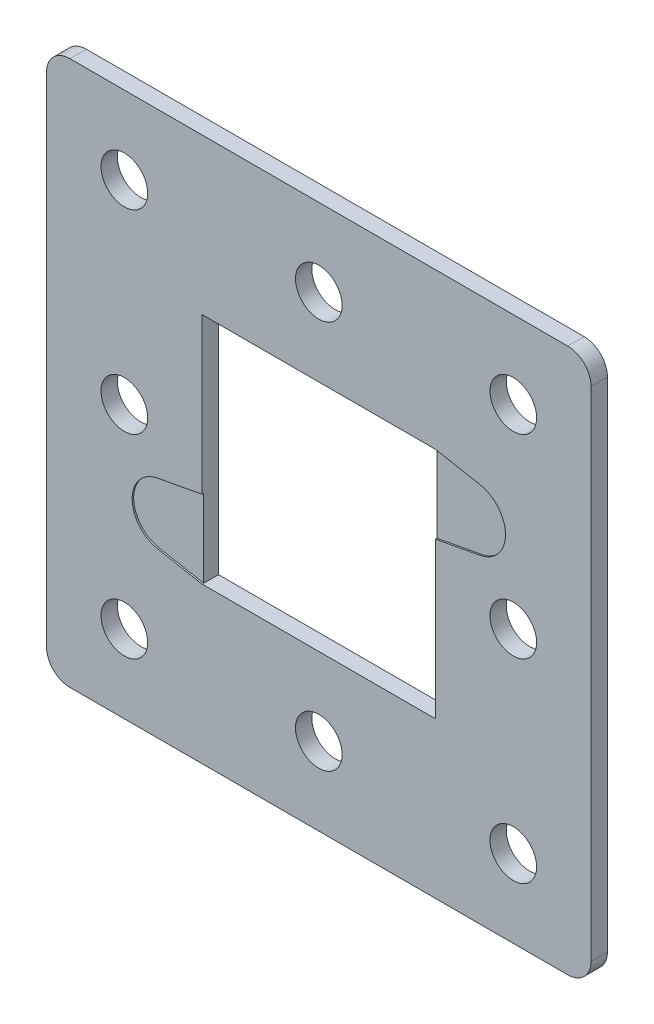
ISO-10303-21;
HEADER;
FILE_DESCRIPTION(('STEP AP214'),'2;1');
FILE_NAME('part.step','',(''),(''),'','','');
FILE_SCHEMA(('AUTOMOTIVE_DESIGN { 1 0 10303 214 1 1 1 1 }'));
ENDSEC;
DATA;
#1=APPLICATION_CONTEXT('core data for automotive mechanical design processes');
#2=APPLICATION_PROTOCOL_DEFINITION('international standard','automotive_design',2000,#1);
#3=PRODUCT_CONTEXT('',#1,'mechanical');
#4=PRODUCT('Part','Part','',(#3));
#5=PRODUCT_RELATED_PRODUCT_CATEGORY('part','',(#4));
#6=PRODUCT_DEFINITION_FORMATION('','',#4);
#7=PRODUCT_DEFINITION_CONTEXT('part definition',#1,'design');
#8=PRODUCT_DEFINITION('design','',#6,#7);
#9=PRODUCT_DEFINITION_SHAPE('','',#8);
#10=(LENGTH_UNIT() NAMED_UNIT(*) SI_UNIT(.MILLI.,.METRE.));
#11=(NAMED_UNIT(*) PLANE_ANGLE_UNIT() SI_UNIT($,.RADIAN.));
#12=(NAMED_UNIT(*) SI_UNIT($,.STERADIAN.) SOLID_ANGLE_UNIT());
#13=UNCERTAINTY_MEASURE_WITH_UNIT(LENGTH_MEASURE(1.E-05),#10,'distance_accuracy_value','');
#14=(GEOMETRIC_REPRESENTATION_CONTEXT(3) GLOBAL_UNCERTAINTY_ASSIGNED_CONTEXT((#13)) GLOBAL_UNIT_ASSIGNED_CONTEXT((#10,
#11,#12)) REPRESENTATION_CONTEXT('',''));
#15=CARTESIAN_POINT('',(0.,0.,0.));
#16=DIRECTION('',(0.,0.,1.));
#17=DIRECTION('',(1.,0.,0.));
#18=AXIS2_PLACEMENT_3D('',#15,#16,#17);
#19=CARTESIAN_POINT('',(35.,-35.,2.105));
#20=DIRECTION('',(-1.,0.,0.));
#21=DIRECTION('',(0.,0.,1.));
#22=AXIS2_PLACEMENT_3D('',#19,#20,#21);
#23=PLANE('',#22);
#24=DIRECTION('',(0.,1.,0.));
#25=VECTOR('',#24,1.);
#26=CARTESIAN_POINT('',(35.,-35.,0.));
#27=LINE('',#26,#25);
#28=CARTESIAN_POINT('',(35.,-32.,0.));
#29=VERTEX_POINT('',#28);
#30=CARTESIAN_POINT('',(35.,32.,0.));
#31=VERTEX_POINT('',#30);
#32=EDGE_CURVE('E305',#29,#31,#27,.T.);
#33=ORIENTED_EDGE('',*,*,#32,.T.);
#34=DIRECTION('',(0.,0.,-1.));
#35=VECTOR('',#34,1.);
#36=CARTESIAN_POINT('',(35.,32.,2.105));
#37=LINE('',#36,#35);
#38=CARTESIAN_POINT('',(35.,32.,2.105));
#39=VERTEX_POINT('',#38);
#40=EDGE_CURVE('E11',#31,#39,#37,.F.);
#41=ORIENTED_EDGE('',*,*,#40,.T.);
#42=DIRECTION('',(0.,1.,0.));
#43=VECTOR('',#42,1.);
#44=CARTESIAN_POINT('',(35.,-35.,2.105));
#45=LINE('',#44,#43);
#46=CARTESIAN_POINT('',(35.,-32.,2.105));
#47=VERTEX_POINT('',#46);
#48=EDGE_CURVE('E308',#47,#39,#45,.T.);
#49=ORIENTED_EDGE('',*,*,#48,.F.);
#50=DIRECTION('',(0.,0.,-1.));
#51=VECTOR('',#50,1.);
#52=CARTESIAN_POINT('',(35.,-32.,2.105));
#53=LINE('',#52,#51);
#54=EDGE_CURVE('E41',#47,#29,#53,.T.);
#55=ORIENTED_EDGE('',*,*,#54,.T.);
#56=EDGE_LOOP('',(#33,#41,#49,#55));
#57=FACE_BOUND('',#56,.T.);
#58=ADVANCED_FACE('F33',(#57),#23,.F.);
#59=CARTESIAN_POINT('',(-35.,35.,2.105));
#60=DIRECTION('',(0.,-1.,0.));
#61=DIRECTION('',(0.,0.,-1.));
#62=AXIS2_PLACEMENT_3D('',#59,#60,#61);
#63=PLANE('',#62);
#64=DIRECTION('',(-1.,0.,0.));
#65=VECTOR('',#64,1.);
#66=CARTESIAN_POINT('',(-35.,35.,0.));
#67=LINE('',#66,#65);
#68=CARTESIAN_POINT('',(32.,35.,0.));
#69=VERTEX_POINT('',#68);
#70=CARTESIAN_POINT('',(-32.,35.,0.));
#71=VERTEX_POINT('',#70);
#72=EDGE_CURVE('E322',#69,#71,#67,.T.);
#73=ORIENTED_EDGE('',*,*,#72,.T.);
#74=DIRECTION('',(0.,0.,-1.));
#75=VECTOR('',#74,1.);
#76=CARTESIAN_POINT('',(-32.,35.,2.105));
#77=LINE('',#76,#75);
#78=CARTESIAN_POINT('',(-32.,35.,2.105));
#79=VERTEX_POINT('',#78);
#80=EDGE_CURVE('E48',#71,#79,#77,.F.);
#81=ORIENTED_EDGE('',*,*,#80,.T.);
#82=DIRECTION('',(-1.,0.,0.));
#83=VECTOR('',#82,1.);
#84=CARTESIAN_POINT('',(-35.,35.,2.105));
#85=LINE('',#84,#83);
#86=CARTESIAN_POINT('',(32.,35.,2.105));
#87=VERTEX_POINT('',#86);
#88=EDGE_CURVE('E310',#87,#79,#85,.T.);
#89=ORIENTED_EDGE('',*,*,#88,.F.);
#90=DIRECTION('',(0.,0.,-1.));
#91=VECTOR('',#90,1.);
#92=CARTESIAN_POINT('',(32.,35.,2.105));
#93=LINE('',#92,#91);
#94=EDGE_CURVE('E353',#87,#69,#93,.T.);
#95=ORIENTED_EDGE('',*,*,#94,.T.);
#96=EDGE_LOOP('',(#73,#81,#89,#95));
#97=FACE_BOUND('',#96,.T.);
#98=ADVANCED_FACE('F371',(#97),#63,.F.);
#99=CARTESIAN_POINT('',(-35.,-35.,2.105));
#100=DIRECTION('',(1.,0.,0.));
#101=DIRECTION('',(0.,0.,-1.));
#102=AXIS2_PLACEMENT_3D('',#99,#100,#101);
#103=PLANE('',#102);
#104=DIRECTION('',(0.,-1.,0.));
#105=VECTOR('',#104,1.);
#106=CARTESIAN_POINT('',(-35.,-35.,0.));
#107=LINE('',#106,#105);
#108=CARTESIAN_POINT('',(-35.,32.,0.));
#109=VERTEX_POINT('',#108);
#110=CARTESIAN_POINT('',(-35.,-32.,0.));
#111=VERTEX_POINT('',#110);
#112=EDGE_CURVE('E324',#109,#111,#107,.T.);
#113=ORIENTED_EDGE('',*,*,#112,.T.);
#114=DIRECTION('',(0.,0.,-1.));
#115=VECTOR('',#114,1.);
#116=CARTESIAN_POINT('',(-35.,-32.,2.105));
#117=LINE('',#116,#115);
#118=CARTESIAN_POINT('',(-35.,-32.,2.105));
#119=VERTEX_POINT('',#118);
#120=EDGE_CURVE('E344',#111,#119,#117,.F.);
#121=ORIENTED_EDGE('',*,*,#120,.T.);
#122=DIRECTION('',(0.,-1.,0.));
#123=VECTOR('',#122,1.);
#124=CARTESIAN_POINT('',(-35.,-35.,2.105));
#125=LINE('',#124,#123);
#126=CARTESIAN_POINT('',(-35.,32.,2.105));
#127=VERTEX_POINT('',#126);
#128=EDGE_CURVE('E313',#127,#119,#125,.T.);
#129=ORIENTED_EDGE('',*,*,#128,.F.);
#130=DIRECTION('',(0.,0.,-1.));
#131=VECTOR('',#130,1.);
#132=CARTESIAN_POINT('',(-35.,32.,2.105));
#133=LINE('',#132,#131);
#134=EDGE_CURVE('E341',#127,#109,#133,.T.);
#135=ORIENTED_EDGE('',*,*,#134,.T.);
#136=EDGE_LOOP('',(#113,#121,#129,#135));
#137=FACE_BOUND('',#136,.T.);
#138=ADVANCED_FACE('F380',(#137),#103,.F.);
#139=CARTESIAN_POINT('',(-35.,-35.,2.105));
#140=DIRECTION('',(0.,1.,0.));
#141=DIRECTION('',(0.,0.,1.));
#142=AXIS2_PLACEMENT_3D('',#139,#140,#141);
#143=PLANE('',#142);
#144=DIRECTION('',(1.,0.,0.));
#145=VECTOR('',#144,1.);
#146=CARTESIAN_POINT('',(-35.,-35.,2.105));
#147=LINE('',#146,#145);
#148=CARTESIAN_POINT('',(-32.,-35.,2.105));
#149=VERTEX_POINT('',#148);
#150=CARTESIAN_POINT('',(32.,-35.,2.105));
#151=VERTEX_POINT('',#150);
#152=EDGE_CURVE('E316',#149,#151,#147,.T.);
#153=ORIENTED_EDGE('',*,*,#152,.F.);
#154=DIRECTION('',(0.,0.,-1.));
#155=VECTOR('',#154,1.);
#156=CARTESIAN_POINT('',(-32.,-35.,2.105));
#157=LINE('',#156,#155);
#158=CARTESIAN_POINT('',(-32.,-35.,0.));
#159=VERTEX_POINT('',#158);
#160=EDGE_CURVE('E330',#149,#159,#157,.T.);
#161=ORIENTED_EDGE('',*,*,#160,.T.);
#162=DIRECTION('',(1.,0.,0.));
#163=VECTOR('',#162,1.);
#164=CARTESIAN_POINT('',(-35.,-35.,0.));
#165=LINE('',#164,#163);
#166=CARTESIAN_POINT('',(32.,-35.,0.));
#167=VERTEX_POINT('',#166);
#168=EDGE_CURVE('E311',#159,#167,#165,.T.);
#169=ORIENTED_EDGE('',*,*,#168,.T.);
#170=DIRECTION('',(0.,0.,-1.));
#171=VECTOR('',#170,1.);
#172=CARTESIAN_POINT('',(32.,-35.,2.105));
#173=LINE('',#172,#171);
#174=EDGE_CURVE('E319',#167,#151,#173,.F.);
#175=ORIENTED_EDGE('',*,*,#174,.T.);
#176=EDGE_LOOP('',(#153,#161,#169,#175));
#177=FACE_BOUND('',#176,.T.);
#178=ADVANCED_FACE('F388',(#177),#143,.F.);
#179=CARTESIAN_POINT('',(0.,0.,2.105));
#180=DIRECTION('',(0.,0.,-1.));
#181=DIRECTION('',(-1.,0.,0.));
#182=AXIS2_PLACEMENT_3D('',#179,#180,#181);
#183=PLANE('',#182);
#184=CARTESIAN_POINT('',(25.,25.,2.105));
#185=DIRECTION('',(0.,0.,1.));
#186=DIRECTION('',(1.,0.,0.));
#187=AXIS2_PLACEMENT_3D('',#184,#185,#186);
#188=CIRCLE('',#187,3.);
#189=CARTESIAN_POINT('',(28.,25.,2.105));
#190=VERTEX_POINT('',#189);
#191=EDGE_CURVE('E282',#190,#190,#188,.T.);
#192=ORIENTED_EDGE('',*,*,#191,.F.);
#193=EDGE_LOOP('',(#192));
#194=FACE_BOUND('',#193,.T.);
#195=CARTESIAN_POINT('',(25.,0.,2.105));
#196=DIRECTION('',(0.,0.,1.));
#197=DIRECTION('',(1.,0.,0.));
#198=AXIS2_PLACEMENT_3D('',#195,#196,#197);
#199=CIRCLE('',#198,3.);
#200=CARTESIAN_POINT('',(28.,0.,2.105));
#201=VERTEX_POINT('',#200);
#202=EDGE_CURVE('E288',#201,#201,#199,.T.);
#203=ORIENTED_EDGE('',*,*,#202,.F.);
#204=EDGE_LOOP('',(#203));
#205=FACE_BOUND('',#204,.T.);
#206=CARTESIAN_POINT('',(25.,-25.,2.105));
#207=DIRECTION('',(0.,0.,1.));
#208=DIRECTION('',(1.,0.,0.));
#209=AXIS2_PLACEMENT_3D('',#206,#207,#208);
#210=CIRCLE('',#209,3.);
#211=CARTESIAN_POINT('',(28.,-25.,2.105));
#212=VERTEX_POINT('',#211);
#213=EDGE_CURVE('E294',#212,#212,#210,.T.);
#214=ORIENTED_EDGE('',*,*,#213,.F.);
#215=EDGE_LOOP('',(#214));
#216=FACE_BOUND('',#215,.T.);
#217=CARTESIAN_POINT('',(0.,-25.,2.105));
#218=DIRECTION('',(0.,0.,1.));
#219=DIRECTION('',(1.,0.,0.));
#220=AXIS2_PLACEMENT_3D('',#217,#218,#219);
#221=CIRCLE('',#220,3.);
#222=CARTESIAN_POINT('',(3.,-25.,2.105));
#223=VERTEX_POINT('',#222);
#224=EDGE_CURVE('E269',#223,#223,#221,.T.);
#225=ORIENTED_EDGE('',*,*,#224,.F.);
#226=EDGE_LOOP('',(#225));
#227=FACE_BOUND('',#226,.T.);
#228=DIRECTION('',(1.,0.,0.));
#229=VECTOR('',#228,1.);
#230=CARTESIAN_POINT('',(-15.,-15.,2.105));
#231=LINE('',#230,#229);
#232=CARTESIAN_POINT('',(-15.,-15.,2.105));
#233=VERTEX_POINT('',#232);
#234=CARTESIAN_POINT('',(15.,-15.,2.105));
#235=VERTEX_POINT('',#234);
#236=EDGE_CURVE('E239',#233,#235,#231,.T.);
#237=ORIENTED_EDGE('',*,*,#236,.F.);
#238=DIRECTION('',(0.98309518948453,-0.18309518948453,0.));
#239=VECTOR('',#238,1.);
#240=CARTESIAN_POINT('',(-15.,-15.,2.105));
#241=LINE('',#240,#239);
#242=CARTESIAN_POINT('',(-20.7323807579381,-13.9323807579381,2.105));
#243=VERTEX_POINT('',#242);
#244=EDGE_CURVE('E185',#243,#233,#241,.T.);
#245=ORIENTED_EDGE('',*,*,#244,.F.);
#246=CARTESIAN_POINT('',(-20.,-10.,2.105));
#247=DIRECTION('',(0.,0.,1.));
#248=DIRECTION('',(1.,0.,0.));
#249=AXIS2_PLACEMENT_3D('',#246,#247,#248);
#250=CIRCLE('',#249,4.);
#251=CARTESIAN_POINT('',(-20.7323807579381,-6.06761924206188,2.105));
#252=VERTEX_POINT('',#251);
#253=EDGE_CURVE('E695',#252,#243,#250,.T.);
#254=ORIENTED_EDGE('',*,*,#253,.F.);
#255=DIRECTION('',(-0.98309518948453,-0.18309518948453,0.));
#256=VECTOR('',#255,1.);
#257=CARTESIAN_POINT('',(-15.,-5.,2.105));
#258=LINE('',#257,#256);
#259=CARTESIAN_POINT('',(-15.,-5.,2.105));
#260=VERTEX_POINT('',#259);
#261=EDGE_CURVE('E220',#260,#252,#258,.T.);
#262=ORIENTED_EDGE('',*,*,#261,.F.);
#263=DIRECTION('',(0.,-1.,0.));
#264=VECTOR('',#263,1.);
#265=CARTESIAN_POINT('',(-15.,-15.,2.105));
#266=LINE('',#265,#264);
#267=CARTESIAN_POINT('',(-15.,15.,2.105));
#268=VERTEX_POINT('',#267);
#269=EDGE_CURVE('E190',#268,#260,#266,.T.);
#270=ORIENTED_EDGE('',*,*,#269,.F.);
#271=DIRECTION('',(-1.,0.,0.));
#272=VECTOR('',#271,1.);
#273=CARTESIAN_POINT('',(-15.,15.,2.105));
#274=LINE('',#273,#272);
#275=CARTESIAN_POINT('',(15.,15.,2.105));
#276=VERTEX_POINT('',#275);
#277=EDGE_CURVE('E252',#276,#268,#274,.T.);
#278=ORIENTED_EDGE('',*,*,#277,.F.);
#279=DIRECTION('',(-0.98309518948453,0.18309518948453,0.));
#280=VECTOR('',#279,1.);
#281=CARTESIAN_POINT('',(15.,15.,2.105));
#282=LINE('',#281,#280);
#283=CARTESIAN_POINT('',(20.7323807579381,13.9323807579381,2.105));
#284=VERTEX_POINT('',#283);
#285=EDGE_CURVE('E211',#284,#276,#282,.T.);
#286=ORIENTED_EDGE('',*,*,#285,.F.);
#287=CARTESIAN_POINT('',(20.,10.,2.105));
#288=DIRECTION('',(0.,0.,1.));
#289=DIRECTION('',(1.,0.,0.));
#290=AXIS2_PLACEMENT_3D('',#287,#288,#289);
#291=CIRCLE('',#290,4.);
#292=CARTESIAN_POINT('',(20.7323807579381,6.06761924206188,2.105));
#293=VERTEX_POINT('',#292);
#294=EDGE_CURVE('E201',#293,#284,#291,.T.);
#295=ORIENTED_EDGE('',*,*,#294,.F.);
#296=DIRECTION('',(0.98309518948453,0.18309518948453,0.));
#297=VECTOR('',#296,1.);
#298=CARTESIAN_POINT('',(15.,5.,2.105));
#299=LINE('',#298,#297);
#300=CARTESIAN_POINT('',(15.,5.,2.105));
#301=VERTEX_POINT('',#300);
#302=EDGE_CURVE('E213',#301,#293,#299,.T.);
#303=ORIENTED_EDGE('',*,*,#302,.F.);
#304=DIRECTION('',(0.,1.,0.));
#305=VECTOR('',#304,1.);
#306=CARTESIAN_POINT('',(15.,-15.,2.105));
#307=LINE('',#306,#305);
#308=EDGE_CURVE('E249',#235,#301,#307,.T.);
#309=ORIENTED_EDGE('',*,*,#308,.F.);
#310=EDGE_LOOP('',(#237,#245,#254,#262,#270,#278,#286,#295,#303,#309));
#311=FACE_BOUND('',#310,.T.);
#312=CARTESIAN_POINT('',(-25.,25.,2.105));
#313=DIRECTION('',(0.,0.,1.));
#314=DIRECTION('',(1.,0.,0.));
#315=AXIS2_PLACEMENT_3D('',#312,#313,#314);
#316=CIRCLE('',#315,3.);
#317=CARTESIAN_POINT('',(-22.,25.,2.105));
#318=VERTEX_POINT('',#317);
#319=EDGE_CURVE('E231',#318,#318,#316,.T.);
#320=ORIENTED_EDGE('',*,*,#319,.F.);
#321=EDGE_LOOP('',(#320));
#322=FACE_BOUND('',#321,.T.);
#323=CARTESIAN_POINT('',(-25.,0.,2.105));
#324=DIRECTION('',(0.,0.,1.));
#325=DIRECTION('',(1.,0.,0.));
#326=AXIS2_PLACEMENT_3D('',#323,#324,#325);
#327=CIRCLE('',#326,3.);
#328=CARTESIAN_POINT('',(-22.,0.,2.105));
#329=VERTEX_POINT('',#328);
#330=EDGE_CURVE('E230',#329,#329,#327,.T.);
#331=ORIENTED_EDGE('',*,*,#330,.F.);
#332=EDGE_LOOP('',(#331));
#333=FACE_BOUND('',#332,.T.);
#334=CARTESIAN_POINT('',(-25.,-25.,2.105));
#335=DIRECTION('',(0.,0.,1.));
#336=DIRECTION('',(1.,0.,0.));
#337=AXIS2_PLACEMENT_3D('',#334,#335,#336);
#338=CIRCLE('',#337,3.);
#339=CARTESIAN_POINT('',(-22.,-25.,2.105));
#340=VERTEX_POINT('',#339);
#341=EDGE_CURVE('E270',#340,#340,#338,.T.);
#342=ORIENTED_EDGE('',*,*,#341,.F.);
#343=EDGE_LOOP('',(#342));
#344=FACE_BOUND('',#343,.T.);
#345=CARTESIAN_POINT('',(0.,25.,2.105));
#346=DIRECTION('',(0.,0.,1.));
#347=DIRECTION('',(1.,0.,0.));
#348=AXIS2_PLACEMENT_3D('',#345,#346,#347);
#349=CIRCLE('',#348,3.);
#350=CARTESIAN_POINT('',(3.,25.,2.105));
#351=VERTEX_POINT('',#350);
#352=EDGE_CURVE('E281',#351,#351,#349,.T.);
#353=ORIENTED_EDGE('',*,*,#352,.F.);
#354=EDGE_LOOP('',(#353));
#355=FACE_BOUND('',#354,.T.);
#356=ORIENTED_EDGE('',*,*,#128,.T.);
#357=CARTESIAN_POINT('',(-32.,-32.,2.105));
#358=DIRECTION('',(0.,0.,-1.));
#359=DIRECTION('',(-1.,0.,0.));
#360=AXIS2_PLACEMENT_3D('',#357,#358,#359);
#361=CIRCLE('',#360,3.);
#362=EDGE_CURVE('E351',#119,#149,#361,.F.);
#363=ORIENTED_EDGE('',*,*,#362,.T.);
#364=ORIENTED_EDGE('',*,*,#152,.T.);
#365=CARTESIAN_POINT('',(32.,-32.,2.105));
#366=DIRECTION('',(0.,0.,-1.));
#367=DIRECTION('',(-1.,0.,0.));
#368=AXIS2_PLACEMENT_3D('',#365,#366,#367);
#369=CIRCLE('',#368,3.);
#370=EDGE_CURVE('E346',#151,#47,#369,.F.);
#371=ORIENTED_EDGE('',*,*,#370,.T.);
#372=ORIENTED_EDGE('',*,*,#48,.T.);
#373=CARTESIAN_POINT('',(32.,32.,2.105));
#374=DIRECTION('',(0.,0.,-1.));
#375=DIRECTION('',(-1.,0.,0.));
#376=AXIS2_PLACEMENT_3D('',#373,#374,#375);
#377=CIRCLE('',#376,3.);
#378=EDGE_CURVE('E55',#39,#87,#377,.F.);
#379=ORIENTED_EDGE('',*,*,#378,.T.);
#380=ORIENTED_EDGE('',*,*,#88,.T.);
#381=CARTESIAN_POINT('',(-32.,32.,2.105));
#382=DIRECTION('',(0.,0.,-1.));
#383=DIRECTION('',(-1.,0.,0.));
#384=AXIS2_PLACEMENT_3D('',#381,#382,#383);
#385=CIRCLE('',#384,3.);
#386=EDGE_CURVE('E349',#79,#127,#385,.F.);
#387=ORIENTED_EDGE('',*,*,#386,.T.);
#388=EDGE_LOOP('',(#356,#363,#364,#371,#372,#379,#380,#387));
#389=FACE_BOUND('',#388,.T.);
#390=ADVANCED_FACE('F373',(#194,#205,#216,#227,#311,#322,#333,#344,#355,#389),#183,.F.);
#391=CARTESIAN_POINT('',(0.,0.,0.));
#392=DIRECTION('',(0.,0.,-1.));
#393=DIRECTION('',(-1.,0.,0.));
#394=AXIS2_PLACEMENT_3D('',#391,#392,#393);
#395=PLANE('',#394);
#396=CARTESIAN_POINT('',(25.,25.,0.));
#397=DIRECTION('',(0.,0.,1.));
#398=DIRECTION('',(1.,0.,0.));
#399=AXIS2_PLACEMENT_3D('',#396,#397,#398);
#400=CIRCLE('',#399,3.);
#401=CARTESIAN_POINT('',(28.,25.,0.));
#402=VERTEX_POINT('',#401);
#403=EDGE_CURVE('E278',#402,#402,#400,.T.);
#404=ORIENTED_EDGE('',*,*,#403,.T.);
#405=EDGE_LOOP('',(#404));
#406=FACE_BOUND('',#405,.T.);
#407=CARTESIAN_POINT('',(25.,0.,0.));
#408=DIRECTION('',(0.,0.,1.));
#409=DIRECTION('',(1.,0.,0.));
#410=AXIS2_PLACEMENT_3D('',#407,#408,#409);
#411=CIRCLE('',#410,3.);
#412=CARTESIAN_POINT('',(28.,0.,0.));
#413=VERTEX_POINT('',#412);
#414=EDGE_CURVE('E285',#413,#413,#411,.T.);
#415=ORIENTED_EDGE('',*,*,#414,.T.);
#416=EDGE_LOOP('',(#415));
#417=FACE_BOUND('',#416,.T.);
#418=CARTESIAN_POINT('',(25.,-25.,0.));
#419=DIRECTION('',(0.,0.,1.));
#420=DIRECTION('',(1.,0.,0.));
#421=AXIS2_PLACEMENT_3D('',#418,#419,#420);
#422=CIRCLE('',#421,3.);
#423=CARTESIAN_POINT('',(28.,-25.,0.));
#424=VERTEX_POINT('',#423);
#425=EDGE_CURVE('E291',#424,#424,#422,.T.);
#426=ORIENTED_EDGE('',*,*,#425,.T.);
#427=EDGE_LOOP('',(#426));
#428=FACE_BOUND('',#427,.T.);
#429=CARTESIAN_POINT('',(0.,-25.,0.));
#430=DIRECTION('',(0.,0.,1.));
#431=DIRECTION('',(1.,0.,0.));
#432=AXIS2_PLACEMENT_3D('',#429,#430,#431);
#433=CIRCLE('',#432,3.);
#434=CARTESIAN_POINT('',(3.,-25.,0.));
#435=VERTEX_POINT('',#434);
#436=EDGE_CURVE('E297',#435,#435,#433,.T.);
#437=ORIENTED_EDGE('',*,*,#436,.T.);
#438=EDGE_LOOP('',(#437));
#439=FACE_BOUND('',#438,.T.);
#440=DIRECTION('',(0.,1.,0.));
#441=VECTOR('',#440,1.);
#442=CARTESIAN_POINT('',(15.,-15.,0.));
#443=LINE('',#442,#441);
#444=CARTESIAN_POINT('',(15.,-15.,0.));
#445=VERTEX_POINT('',#444);
#446=CARTESIAN_POINT('',(15.,15.,0.));
#447=VERTEX_POINT('',#446);
#448=EDGE_CURVE('E235',#445,#447,#443,.T.);
#449=ORIENTED_EDGE('',*,*,#448,.T.);
#450=DIRECTION('',(-1.,0.,0.));
#451=VECTOR('',#450,1.);
#452=CARTESIAN_POINT('',(-15.,15.,0.));
#453=LINE('',#452,#451);
#454=CARTESIAN_POINT('',(-15.,15.,0.));
#455=VERTEX_POINT('',#454);
#456=EDGE_CURVE('E238',#447,#455,#453,.T.);
#457=ORIENTED_EDGE('',*,*,#456,.T.);
#458=DIRECTION('',(0.,-1.,0.));
#459=VECTOR('',#458,1.);
#460=CARTESIAN_POINT('',(-15.,-15.,0.));
#461=LINE('',#460,#459);
#462=CARTESIAN_POINT('',(-15.,-15.,0.));
#463=VERTEX_POINT('',#462);
#464=EDGE_CURVE('E242',#455,#463,#461,.T.);
#465=ORIENTED_EDGE('',*,*,#464,.T.);
#466=DIRECTION('',(1.,0.,0.));
#467=VECTOR('',#466,1.);
#468=CARTESIAN_POINT('',(-15.,-15.,0.));
#469=LINE('',#468,#467);
#470=EDGE_CURVE('E245',#463,#445,#469,.T.);
#471=ORIENTED_EDGE('',*,*,#470,.T.);
#472=EDGE_LOOP('',(#449,#457,#465,#471));
#473=FACE_BOUND('',#472,.T.);
#474=CARTESIAN_POINT('',(-25.,25.,0.));
#475=DIRECTION('',(0.,0.,1.));
#476=DIRECTION('',(1.,0.,0.));
#477=AXIS2_PLACEMENT_3D('',#474,#475,#476);
#478=CIRCLE('',#477,3.);
#479=CARTESIAN_POINT('',(-22.,25.,0.));
#480=VERTEX_POINT('',#479);
#481=EDGE_CURVE('E227',#480,#480,#478,.T.);
#482=ORIENTED_EDGE('',*,*,#481,.T.);
#483=EDGE_LOOP('',(#482));
#484=FACE_BOUND('',#483,.T.);
#485=CARTESIAN_POINT('',(-25.,0.,0.));
#486=DIRECTION('',(0.,0.,1.));
#487=DIRECTION('',(1.,0.,0.));
#488=AXIS2_PLACEMENT_3D('',#485,#486,#487);
#489=CIRCLE('',#488,3.);
#490=CARTESIAN_POINT('',(-22.,0.,0.));
#491=VERTEX_POINT('',#490);
#492=EDGE_CURVE('E273',#491,#491,#489,.T.);
#493=ORIENTED_EDGE('',*,*,#492,.T.);
#494=EDGE_LOOP('',(#493));
#495=FACE_BOUND('',#494,.T.);
#496=CARTESIAN_POINT('',(-25.,-25.,0.));
#497=DIRECTION('',(0.,0.,1.));
#498=DIRECTION('',(1.,0.,0.));
#499=AXIS2_PLACEMENT_3D('',#496,#497,#498);
#500=CIRCLE('',#499,3.);
#501=CARTESIAN_POINT('',(-22.,-25.,0.));
#502=VERTEX_POINT('',#501);
#503=EDGE_CURVE('E266',#502,#502,#500,.T.);
#504=ORIENTED_EDGE('',*,*,#503,.T.);
#505=EDGE_LOOP('',(#504));
#506=FACE_BOUND('',#505,.T.);
#507=CARTESIAN_POINT('',(0.,25.,0.));
#508=DIRECTION('',(0.,0.,1.));
#509=DIRECTION('',(1.,0.,0.));
#510=AXIS2_PLACEMENT_3D('',#507,#508,#509);
#511=CIRCLE('',#510,3.);
#512=CARTESIAN_POINT('',(3.,25.,0.));
#513=VERTEX_POINT('',#512);
#514=EDGE_CURVE('E302',#513,#513,#511,.T.);
#515=ORIENTED_EDGE('',*,*,#514,.T.);
#516=EDGE_LOOP('',(#515));
#517=FACE_BOUND('',#516,.T.);
#518=ORIENTED_EDGE('',*,*,#168,.F.);
#519=CARTESIAN_POINT('',(-32.,-32.,0.));
#520=DIRECTION('',(0.,0.,-1.));
#521=DIRECTION('',(-1.,0.,0.));
#522=AXIS2_PLACEMENT_3D('',#519,#520,#521);
#523=CIRCLE('',#522,3.);
#524=EDGE_CURVE('E339',#159,#111,#523,.T.);
#525=ORIENTED_EDGE('',*,*,#524,.T.);
#526=ORIENTED_EDGE('',*,*,#112,.F.);
#527=CARTESIAN_POINT('',(-32.,32.,0.));
#528=DIRECTION('',(0.,0.,-1.));
#529=DIRECTION('',(-1.,0.,0.));
#530=AXIS2_PLACEMENT_3D('',#527,#528,#529);
#531=CIRCLE('',#530,3.);
#532=EDGE_CURVE('E337',#109,#71,#531,.T.);
#533=ORIENTED_EDGE('',*,*,#532,.T.);
#534=ORIENTED_EDGE('',*,*,#72,.F.);
#535=CARTESIAN_POINT('',(32.,32.,0.));
#536=DIRECTION('',(0.,0.,-1.));
#537=DIRECTION('',(-1.,0.,0.));
#538=AXIS2_PLACEMENT_3D('',#535,#536,#537);
#539=CIRCLE('',#538,3.);
#540=EDGE_CURVE('E335',#69,#31,#539,.T.);
#541=ORIENTED_EDGE('',*,*,#540,.T.);
#542=ORIENTED_EDGE('',*,*,#32,.F.);
#543=CARTESIAN_POINT('',(32.,-32.,0.));
#544=DIRECTION('',(0.,0.,-1.));
#545=DIRECTION('',(-1.,0.,0.));
#546=AXIS2_PLACEMENT_3D('',#543,#544,#545);
#547=CIRCLE('',#546,3.);
#548=EDGE_CURVE('E333',#29,#167,#547,.T.);
#549=ORIENTED_EDGE('',*,*,#548,.T.);
#550=EDGE_LOOP('',(#518,#525,#526,#533,#534,#541,#542,#549));
#551=FACE_BOUND('',#550,.T.);
#552=ADVANCED_FACE('F366',(#406,#417,#428,#439,#473,#484,#495,#506,#517,#551),#395,.T.);
#553=CARTESIAN_POINT('',(0.,25.,0.));
#554=DIRECTION('',(0.,0.,1.));
#555=DIRECTION('',(1.,0.,0.));
#556=AXIS2_PLACEMENT_3D('',#553,#554,#555);
#557=CYLINDRICAL_SURFACE('',#556,3.);
#558=ORIENTED_EDGE('',*,*,#514,.F.);
#559=EDGE_LOOP('',(#558));
#560=FACE_BOUND('',#559,.T.);
#561=ORIENTED_EDGE('',*,*,#352,.T.);
#562=EDGE_LOOP('',(#561));
#563=FACE_BOUND('',#562,.T.);
#564=ADVANCED_FACE('F591',(#560,#563),#557,.F.);
#565=CARTESIAN_POINT('',(-25.,-25.,0.));
#566=DIRECTION('',(0.,0.,1.));
#567=DIRECTION('',(1.,0.,0.));
#568=AXIS2_PLACEMENT_3D('',#565,#566,#567);
#569=CYLINDRICAL_SURFACE('',#568,3.);
#570=ORIENTED_EDGE('',*,*,#503,.F.);
#571=EDGE_LOOP('',(#570));
#572=FACE_BOUND('',#571,.T.);
#573=ORIENTED_EDGE('',*,*,#341,.T.);
#574=EDGE_LOOP('',(#573));
#575=FACE_BOUND('',#574,.T.);
#576=ADVANCED_FACE('F582',(#572,#575),#569,.F.);
#577=CARTESIAN_POINT('',(-25.,0.,0.));
#578=DIRECTION('',(0.,0.,1.));
#579=DIRECTION('',(1.,0.,0.));
#580=AXIS2_PLACEMENT_3D('',#577,#578,#579);
#581=CYLINDRICAL_SURFACE('',#580,3.);
#582=ORIENTED_EDGE('',*,*,#492,.F.);
#583=EDGE_LOOP('',(#582));
#584=FACE_BOUND('',#583,.T.);
#585=ORIENTED_EDGE('',*,*,#330,.T.);
#586=EDGE_LOOP('',(#585));
#587=FACE_BOUND('',#586,.T.);
#588=ADVANCED_FACE('F573',(#584,#587),#581,.F.);
#589=CARTESIAN_POINT('',(-25.,25.,0.));
#590=DIRECTION('',(0.,0.,1.));
#591=DIRECTION('',(1.,0.,0.));
#592=AXIS2_PLACEMENT_3D('',#589,#590,#591);
#593=CYLINDRICAL_SURFACE('',#592,3.);
#594=ORIENTED_EDGE('',*,*,#481,.F.);
#595=EDGE_LOOP('',(#594));
#596=FACE_BOUND('',#595,.T.);
#597=ORIENTED_EDGE('',*,*,#319,.T.);
#598=EDGE_LOOP('',(#597));
#599=FACE_BOUND('',#598,.T.);
#600=ADVANCED_FACE('F565',(#596,#599),#593,.F.);
#601=CARTESIAN_POINT('',(15.,-15.,0.));
#602=DIRECTION('',(1.,0.,0.));
#603=DIRECTION('',(0.,0.,-1.));
#604=AXIS2_PLACEMENT_3D('',#601,#602,#603);
#605=PLANE('',#604);
#606=ORIENTED_EDGE('',*,*,#308,.T.);
#607=DIRECTION('',(0.,0.,1.));
#608=VECTOR('',#607,1.);
#609=CARTESIAN_POINT('',(15.,5.,1.905));
#610=LINE('',#609,#608);
#611=CARTESIAN_POINT('',(15.,5.,1.905));
#612=VERTEX_POINT('',#611);
#613=EDGE_CURVE('E223',#612,#301,#610,.T.);
#614=ORIENTED_EDGE('',*,*,#613,.F.);
#615=DIRECTION('',(0.,-1.,0.));
#616=VECTOR('',#615,1.);
#617=CARTESIAN_POINT('',(15.,5.,1.905));
#618=LINE('',#617,#616);
#619=CARTESIAN_POINT('',(15.,15.,1.905));
#620=VERTEX_POINT('',#619);
#621=EDGE_CURVE('E200',#620,#612,#618,.T.);
#622=ORIENTED_EDGE('',*,*,#621,.F.);
#623=DIRECTION('',(0.,0.,1.));
#624=VECTOR('',#623,1.);
#625=CARTESIAN_POINT('',(15.,15.,0.));
#626=LINE('',#625,#624);
#627=EDGE_CURVE('E248',#447,#620,#626,.T.);
#628=ORIENTED_EDGE('',*,*,#627,.F.);
#629=ORIENTED_EDGE('',*,*,#448,.F.);
#630=DIRECTION('',(0.,0.,1.));
#631=VECTOR('',#630,1.);
#632=CARTESIAN_POINT('',(15.,-15.,0.));
#633=LINE('',#632,#631);
#634=EDGE_CURVE('E234',#445,#235,#633,.T.);
#635=ORIENTED_EDGE('',*,*,#634,.T.);
#636=EDGE_LOOP('',(#606,#614,#622,#628,#629,#635));
#637=FACE_BOUND('',#636,.T.);
#638=ADVANCED_FACE('F557',(#637),#605,.F.);
#639=CARTESIAN_POINT('',(-15.,-15.,0.));
#640=DIRECTION('',(0.,-1.,0.));
#641=DIRECTION('',(0.,0.,-1.));
#642=AXIS2_PLACEMENT_3D('',#639,#640,#641);
#643=PLANE('',#642);
#644=ORIENTED_EDGE('',*,*,#236,.T.);
#645=ORIENTED_EDGE('',*,*,#634,.F.);
#646=ORIENTED_EDGE('',*,*,#470,.F.);
#647=DIRECTION('',(0.,0.,1.));
#648=VECTOR('',#647,1.);
#649=CARTESIAN_POINT('',(-15.,-15.,0.));
#650=LINE('',#649,#648);
#651=CARTESIAN_POINT('',(-15.,-15.,1.905));
#652=VERTEX_POINT('',#651);
#653=EDGE_CURVE('E260',#463,#652,#650,.T.);
#654=ORIENTED_EDGE('',*,*,#653,.T.);
#655=DIRECTION('',(0.,0.,1.));
#656=VECTOR('',#655,1.);
#657=CARTESIAN_POINT('',(-15.,-15.,1.905));
#658=LINE('',#657,#656);
#659=EDGE_CURVE('E253',#652,#233,#658,.T.);
#660=ORIENTED_EDGE('',*,*,#659,.T.);
#661=EDGE_LOOP('',(#644,#645,#646,#654,#660));
#662=FACE_BOUND('',#661,.T.);
#663=ADVANCED_FACE('F549',(#662),#643,.F.);
#664=CARTESIAN_POINT('',(-15.,-15.,0.));
#665=DIRECTION('',(-1.,0.,0.));
#666=DIRECTION('',(0.,0.,1.));
#667=AXIS2_PLACEMENT_3D('',#664,#665,#666);
#668=PLANE('',#667);
#669=ORIENTED_EDGE('',*,*,#269,.T.);
#670=DIRECTION('',(0.,0.,1.));
#671=VECTOR('',#670,1.);
#672=CARTESIAN_POINT('',(-15.,-5.,1.905));
#673=LINE('',#672,#671);
#674=CARTESIAN_POINT('',(-15.,-5.,1.905));
#675=VERTEX_POINT('',#674);
#676=EDGE_CURVE('E169',#675,#260,#673,.T.);
#677=ORIENTED_EDGE('',*,*,#676,.F.);
#678=DIRECTION('',(0.,1.,0.));
#679=VECTOR('',#678,1.);
#680=CARTESIAN_POINT('',(-15.,-15.,1.905));
#681=LINE('',#680,#679);
#682=EDGE_CURVE('E176',#652,#675,#681,.T.);
#683=ORIENTED_EDGE('',*,*,#682,.F.);
#684=ORIENTED_EDGE('',*,*,#653,.F.);
#685=ORIENTED_EDGE('',*,*,#464,.F.);
#686=DIRECTION('',(0.,0.,1.));
#687=VECTOR('',#686,1.);
#688=CARTESIAN_POINT('',(-15.,15.,0.));
#689=LINE('',#688,#687);
#690=EDGE_CURVE('E262',#455,#268,#689,.T.);
#691=ORIENTED_EDGE('',*,*,#690,.T.);
#692=EDGE_LOOP('',(#669,#677,#683,#684,#685,#691));
#693=FACE_BOUND('',#692,.T.);
#694=ADVANCED_FACE('F188',(#693),#668,.F.);
#695=CARTESIAN_POINT('',(-15.,15.,0.));
#696=DIRECTION('',(0.,1.,0.));
#697=DIRECTION('',(0.,0.,1.));
#698=AXIS2_PLACEMENT_3D('',#695,#696,#697);
#699=PLANE('',#698);
#700=ORIENTED_EDGE('',*,*,#277,.T.);
#701=ORIENTED_EDGE('',*,*,#690,.F.);
#702=ORIENTED_EDGE('',*,*,#456,.F.);
#703=ORIENTED_EDGE('',*,*,#627,.T.);
#704=DIRECTION('',(0.,0.,1.));
#705=VECTOR('',#704,1.);
#706=CARTESIAN_POINT('',(15.,15.,1.905));
#707=LINE('',#706,#705);
#708=EDGE_CURVE('E210',#620,#276,#707,.T.);
#709=ORIENTED_EDGE('',*,*,#708,.T.);
#710=EDGE_LOOP('',(#700,#701,#702,#703,#709));
#711=FACE_BOUND('',#710,.T.);
#712=ADVANCED_FACE('F532',(#711),#699,.F.);
#713=CARTESIAN_POINT('',(0.,-25.,0.));
#714=DIRECTION('',(0.,0.,1.));
#715=DIRECTION('',(1.,0.,0.));
#716=AXIS2_PLACEMENT_3D('',#713,#714,#715);
#717=CYLINDRICAL_SURFACE('',#716,3.);
#718=ORIENTED_EDGE('',*,*,#436,.F.);
#719=EDGE_LOOP('',(#718));
#720=FACE_BOUND('',#719,.T.);
#721=ORIENTED_EDGE('',*,*,#224,.T.);
#722=EDGE_LOOP('',(#721));
#723=FACE_BOUND('',#722,.T.);
#724=ADVANCED_FACE('F523',(#720,#723),#717,.F.);
#725=CARTESIAN_POINT('',(25.,-25.,0.));
#726=DIRECTION('',(0.,0.,1.));
#727=DIRECTION('',(1.,0.,0.));
#728=AXIS2_PLACEMENT_3D('',#725,#726,#727);
#729=CYLINDRICAL_SURFACE('',#728,3.);
#730=ORIENTED_EDGE('',*,*,#425,.F.);
#731=EDGE_LOOP('',(#730));
#732=FACE_BOUND('',#731,.T.);
#733=ORIENTED_EDGE('',*,*,#213,.T.);
#734=EDGE_LOOP('',(#733));
#735=FACE_BOUND('',#734,.T.);
#736=ADVANCED_FACE('F514',(#732,#735),#729,.F.);
#737=CARTESIAN_POINT('',(25.,0.,0.));
#738=DIRECTION('',(0.,0.,1.));
#739=DIRECTION('',(1.,0.,0.));
#740=AXIS2_PLACEMENT_3D('',#737,#738,#739);
#741=CYLINDRICAL_SURFACE('',#740,3.);
#742=ORIENTED_EDGE('',*,*,#414,.F.);
#743=EDGE_LOOP('',(#742));
#744=FACE_BOUND('',#743,.T.);
#745=ORIENTED_EDGE('',*,*,#202,.T.);
#746=EDGE_LOOP('',(#745));
#747=FACE_BOUND('',#746,.T.);
#748=ADVANCED_FACE('F504',(#744,#747),#741,.F.);
#749=CARTESIAN_POINT('',(25.,25.,0.));
#750=DIRECTION('',(0.,0.,1.));
#751=DIRECTION('',(1.,0.,0.));
#752=AXIS2_PLACEMENT_3D('',#749,#750,#751);
#753=CYLINDRICAL_SURFACE('',#752,3.);
#754=ORIENTED_EDGE('',*,*,#403,.F.);
#755=EDGE_LOOP('',(#754));
#756=FACE_BOUND('',#755,.T.);
#757=ORIENTED_EDGE('',*,*,#191,.T.);
#758=EDGE_LOOP('',(#757));
#759=FACE_BOUND('',#758,.T.);
#760=ADVANCED_FACE('F494',(#756,#759),#753,.F.);
#761=CARTESIAN_POINT('',(15.,15.,1.905));
#762=DIRECTION('',(0.18309518948453,0.98309518948453,0.));
#763=DIRECTION('',(-0.98309518948453,0.18309518948453,0.));
#764=AXIS2_PLACEMENT_3D('',#761,#762,#763);
#765=PLANE('',#764);
#766=ORIENTED_EDGE('',*,*,#285,.T.);
#767=ORIENTED_EDGE('',*,*,#708,.F.);
#768=DIRECTION('',(-0.98309518948453,0.18309518948453,0.));
#769=VECTOR('',#768,1.);
#770=CARTESIAN_POINT('',(15.,15.,1.905));
#771=LINE('',#770,#769);
#772=CARTESIAN_POINT('',(20.7323807579381,13.9323807579381,1.905));
#773=VERTEX_POINT('',#772);
#774=EDGE_CURVE('E197',#773,#620,#771,.T.);
#775=ORIENTED_EDGE('',*,*,#774,.F.);
#776=DIRECTION('',(0.,0.,1.));
#777=VECTOR('',#776,1.);
#778=CARTESIAN_POINT('',(20.7323807579381,13.9323807579381,1.905));
#779=LINE('',#778,#777);
#780=EDGE_CURVE('E218',#773,#284,#779,.T.);
#781=ORIENTED_EDGE('',*,*,#780,.T.);
#782=EDGE_LOOP('',(#766,#767,#775,#781));
#783=FACE_BOUND('',#782,.T.);
#784=ADVANCED_FACE('F485',(#783),#765,.F.);
#785=CARTESIAN_POINT('',(20.,10.,1.905));
#786=DIRECTION('',(0.,0.,1.));
#787=DIRECTION('',(1.,0.,0.));
#788=AXIS2_PLACEMENT_3D('',#785,#786,#787);
#789=CYLINDRICAL_SURFACE('',#788,4.);
#790=ORIENTED_EDGE('',*,*,#294,.T.);
#791=ORIENTED_EDGE('',*,*,#780,.F.);
#792=CARTESIAN_POINT('',(20.,10.,1.905));
#793=DIRECTION('',(0.,0.,1.));
#794=DIRECTION('',(1.,0.,0.));
#795=AXIS2_PLACEMENT_3D('',#792,#793,#794);
#796=CIRCLE('',#795,4.);
#797=CARTESIAN_POINT('',(20.7323807579381,6.06761924206188,1.905));
#798=VERTEX_POINT('',#797);
#799=EDGE_CURVE('E207',#798,#773,#796,.T.);
#800=ORIENTED_EDGE('',*,*,#799,.F.);
#801=DIRECTION('',(0.,0.,1.));
#802=VECTOR('',#801,1.);
#803=CARTESIAN_POINT('',(20.7323807579381,6.06761924206188,1.905));
#804=LINE('',#803,#802);
#805=EDGE_CURVE('E221',#798,#293,#804,.T.);
#806=ORIENTED_EDGE('',*,*,#805,.T.);
#807=EDGE_LOOP('',(#790,#791,#800,#806));
#808=FACE_BOUND('',#807,.T.);
#809=ADVANCED_FACE('F476',(#808),#789,.F.);
#810=CARTESIAN_POINT('',(15.,5.,1.905));
#811=DIRECTION('',(0.18309518948453,-0.98309518948453,0.));
#812=DIRECTION('',(0.98309518948453,0.18309518948453,0.));
#813=AXIS2_PLACEMENT_3D('',#810,#811,#812);
#814=PLANE('',#813);
#815=ORIENTED_EDGE('',*,*,#302,.T.);
#816=ORIENTED_EDGE('',*,*,#805,.F.);
#817=DIRECTION('',(0.98309518948453,0.18309518948453,0.));
#818=VECTOR('',#817,1.);
#819=CARTESIAN_POINT('',(15.,5.,1.905));
#820=LINE('',#819,#818);
#821=EDGE_CURVE('E204',#612,#798,#820,.T.);
#822=ORIENTED_EDGE('',*,*,#821,.F.);
#823=ORIENTED_EDGE('',*,*,#613,.T.);
#824=EDGE_LOOP('',(#815,#816,#822,#823));
#825=FACE_BOUND('',#824,.T.);
#826=ADVANCED_FACE('F467',(#825),#814,.F.);
#827=CARTESIAN_POINT('',(20.,10.,1.905));
#828=DIRECTION('',(0.,0.,1.));
#829=DIRECTION('',(1.,0.,0.));
#830=AXIS2_PLACEMENT_3D('',#827,#828,#829);
#831=PLANE('',#830);
#832=ORIENTED_EDGE('',*,*,#774,.T.);
#833=ORIENTED_EDGE('',*,*,#621,.T.);
#834=ORIENTED_EDGE('',*,*,#821,.T.);
#835=ORIENTED_EDGE('',*,*,#799,.T.);
#836=EDGE_LOOP('',(#832,#833,#834,#835));
#837=FACE_BOUND('',#836,.T.);
#838=ADVANCED_FACE('F458',(#837),#831,.T.);
#839=CARTESIAN_POINT('',(-15.,-15.,1.905));
#840=DIRECTION('',(-0.18309518948453,-0.98309518948453,0.));
#841=DIRECTION('',(0.98309518948453,-0.18309518948453,0.));
#842=AXIS2_PLACEMENT_3D('',#839,#840,#841);
#843=PLANE('',#842);
#844=ORIENTED_EDGE('',*,*,#244,.T.);
#845=ORIENTED_EDGE('',*,*,#659,.F.);
#846=DIRECTION('',(0.98309518948453,-0.18309518948453,0.));
#847=VECTOR('',#846,1.);
#848=CARTESIAN_POINT('',(-15.,-15.,1.905));
#849=LINE('',#848,#847);
#850=CARTESIAN_POINT('',(-20.7323807579381,-13.9323807579381,1.905));
#851=VERTEX_POINT('',#850);
#852=EDGE_CURVE('E181',#851,#652,#849,.T.);
#853=ORIENTED_EDGE('',*,*,#852,.F.);
#854=DIRECTION('',(0.,0.,1.));
#855=VECTOR('',#854,1.);
#856=CARTESIAN_POINT('',(-20.7323807579381,-13.9323807579381,1.905));
#857=LINE('',#856,#855);
#858=EDGE_CURVE('E192',#851,#243,#857,.T.);
#859=ORIENTED_EDGE('',*,*,#858,.T.);
#860=EDGE_LOOP('',(#844,#845,#853,#859));
#861=FACE_BOUND('',#860,.T.);
#862=ADVANCED_FACE('F449',(#861),#843,.F.);
#863=CARTESIAN_POINT('',(-20.,-10.,1.905));
#864=DIRECTION('',(0.,0.,1.));
#865=DIRECTION('',(1.,0.,0.));
#866=AXIS2_PLACEMENT_3D('',#863,#864,#865);
#867=CYLINDRICAL_SURFACE('',#866,4.);
#868=ORIENTED_EDGE('',*,*,#253,.T.);
#869=ORIENTED_EDGE('',*,*,#858,.F.);
#870=CARTESIAN_POINT('',(-20.,-10.,1.905));
#871=DIRECTION('',(0.,0.,1.));
#872=DIRECTION('',(1.,0.,0.));
#873=AXIS2_PLACEMENT_3D('',#870,#871,#872);
#874=CIRCLE('',#873,4.);
#875=CARTESIAN_POINT('',(-20.7323807579381,-6.06761924206188,1.905));
#876=VERTEX_POINT('',#875);
#877=EDGE_CURVE('E175',#876,#851,#874,.T.);
#878=ORIENTED_EDGE('',*,*,#877,.F.);
#879=DIRECTION('',(0.,0.,1.));
#880=VECTOR('',#879,1.);
#881=CARTESIAN_POINT('',(-20.7323807579381,-6.06761924206188,1.905));
#882=LINE('',#881,#880);
#883=EDGE_CURVE('E171',#876,#252,#882,.T.);
#884=ORIENTED_EDGE('',*,*,#883,.T.);
#885=EDGE_LOOP('',(#868,#869,#878,#884));
#886=FACE_BOUND('',#885,.T.);
#887=ADVANCED_FACE('F441',(#886),#867,.F.);
#888=CARTESIAN_POINT('',(-15.,-5.,1.905));
#889=DIRECTION('',(-0.18309518948453,0.98309518948453,0.));
#890=DIRECTION('',(-0.98309518948453,-0.18309518948453,0.));
#891=AXIS2_PLACEMENT_3D('',#888,#889,#890);
#892=PLANE('',#891);
#893=ORIENTED_EDGE('',*,*,#261,.T.);
#894=ORIENTED_EDGE('',*,*,#883,.F.);
#895=DIRECTION('',(-0.98309518948453,-0.18309518948453,0.));
#896=VECTOR('',#895,1.);
#897=CARTESIAN_POINT('',(-15.,-5.,1.905));
#898=LINE('',#897,#896);
#899=EDGE_CURVE('E164',#675,#876,#898,.T.);
#900=ORIENTED_EDGE('',*,*,#899,.F.);
#901=ORIENTED_EDGE('',*,*,#676,.T.);
#902=EDGE_LOOP('',(#893,#894,#900,#901));
#903=FACE_BOUND('',#902,.T.);
#904=ADVANCED_FACE('F167',(#903),#892,.F.);
#905=CARTESIAN_POINT('',(-20.,-10.,1.905));
#906=DIRECTION('',(0.,0.,1.));
#907=DIRECTION('',(1.,0.,0.));
#908=AXIS2_PLACEMENT_3D('',#905,#906,#907);
#909=PLANE('',#908);
#910=ORIENTED_EDGE('',*,*,#682,.T.);
#911=ORIENTED_EDGE('',*,*,#899,.T.);
#912=ORIENTED_EDGE('',*,*,#877,.T.);
#913=ORIENTED_EDGE('',*,*,#852,.T.);
#914=EDGE_LOOP('',(#910,#911,#912,#913));
#915=FACE_BOUND('',#914,.T.);
#916=ADVANCED_FACE('F179',(#915),#909,.T.);
#917=CARTESIAN_POINT('',(-32.,-32.,2.105));
#918=DIRECTION('',(0.,0.,-1.));
#919=DIRECTION('',(-1.,0.,0.));
#920=AXIS2_PLACEMENT_3D('',#917,#918,#919);
#921=CYLINDRICAL_SURFACE('',#920,3.);
#922=ORIENTED_EDGE('',*,*,#362,.F.);
#923=ORIENTED_EDGE('',*,*,#120,.F.);
#924=ORIENTED_EDGE('',*,*,#524,.F.);
#925=ORIENTED_EDGE('',*,*,#160,.F.);
#926=EDGE_LOOP('',(#922,#923,#924,#925));
#927=FACE_BOUND('',#926,.T.);
#928=ADVANCED_FACE('F385',(#927),#921,.T.);
#929=CARTESIAN_POINT('',(-32.,32.,2.105));
#930=DIRECTION('',(0.,0.,-1.));
#931=DIRECTION('',(-1.,0.,0.));
#932=AXIS2_PLACEMENT_3D('',#929,#930,#931);
#933=CYLINDRICAL_SURFACE('',#932,3.);
#934=ORIENTED_EDGE('',*,*,#386,.F.);
#935=ORIENTED_EDGE('',*,*,#80,.F.);
#936=ORIENTED_EDGE('',*,*,#532,.F.);
#937=ORIENTED_EDGE('',*,*,#134,.F.);
#938=EDGE_LOOP('',(#934,#935,#936,#937));
#939=FACE_BOUND('',#938,.T.);
#940=ADVANCED_FACE('F377',(#939),#933,.T.);
#941=CARTESIAN_POINT('',(32.,32.,2.105));
#942=DIRECTION('',(0.,0.,-1.));
#943=DIRECTION('',(-1.,0.,0.));
#944=AXIS2_PLACEMENT_3D('',#941,#942,#943);
#945=CYLINDRICAL_SURFACE('',#944,3.);
#946=ORIENTED_EDGE('',*,*,#378,.F.);
#947=ORIENTED_EDGE('',*,*,#40,.F.);
#948=ORIENTED_EDGE('',*,*,#540,.F.);
#949=ORIENTED_EDGE('',*,*,#94,.F.);
#950=EDGE_LOOP('',(#946,#947,#948,#949));
#951=FACE_BOUND('',#950,.T.);
#952=ADVANCED_FACE('F370',(#951),#945,.T.);
#953=CARTESIAN_POINT('',(32.,-32.,2.105));
#954=DIRECTION('',(0.,0.,-1.));
#955=DIRECTION('',(-1.,0.,0.));
#956=AXIS2_PLACEMENT_3D('',#953,#954,#955);
#957=CYLINDRICAL_SURFACE('',#956,3.);
#958=ORIENTED_EDGE('',*,*,#370,.F.);
#959=ORIENTED_EDGE('',*,*,#174,.F.);
#960=ORIENTED_EDGE('',*,*,#548,.F.);
#961=ORIENTED_EDGE('',*,*,#54,.F.);
#962=EDGE_LOOP('',(#958,#959,#960,#961));
#963=FACE_BOUND('',#962,.T.);
#964=ADVANCED_FACE('F35',(#963),#957,.T.);
#965=CLOSED_SHELL('',(#58,#98,#138,#178,#390,#552,#564,#576,#588,#600,#638,#663,#694,#712,#724,
#736,#748,#760,#784,#809,#826,#838,#862,#887,#904,#916,#928,#940,#952,#964));
#966=MANIFOLD_SOLID_BREP('B2',#965);
#967=ADVANCED_BREP_SHAPE_REPRESENTATION('',(#18,#966),#14);
#968=SHAPE_DEFINITION_REPRESENTATION(#9,#967);
ENDSEC;
END-ISO-10303-21;
